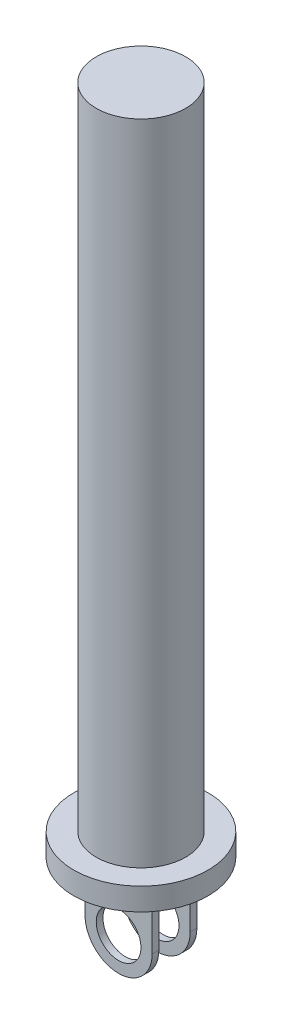
ISO-10303-21;
HEADER;
FILE_DESCRIPTION(('STEP AP214'),'2;1');
FILE_NAME('part.step','',(''),(''),'','','');
FILE_SCHEMA(('AUTOMOTIVE_DESIGN { 1 0 10303 214 1 1 1 1 }'));
ENDSEC;
DATA;
#1=APPLICATION_CONTEXT('core data for automotive mechanical design processes');
#2=APPLICATION_PROTOCOL_DEFINITION('international standard','automotive_design',2000,#1);
#3=PRODUCT_CONTEXT('',#1,'mechanical');
#4=PRODUCT('Part','Part','',(#3));
#5=PRODUCT_RELATED_PRODUCT_CATEGORY('part','',(#4));
#6=PRODUCT_DEFINITION_FORMATION('','',#4);
#7=PRODUCT_DEFINITION_CONTEXT('part definition',#1,'design');
#8=PRODUCT_DEFINITION('design','',#6,#7);
#9=PRODUCT_DEFINITION_SHAPE('','',#8);
#10=(LENGTH_UNIT() NAMED_UNIT(*) SI_UNIT(.MILLI.,.METRE.));
#11=(NAMED_UNIT(*) PLANE_ANGLE_UNIT() SI_UNIT($,.RADIAN.));
#12=(NAMED_UNIT(*) SI_UNIT($,.STERADIAN.) SOLID_ANGLE_UNIT());
#13=UNCERTAINTY_MEASURE_WITH_UNIT(LENGTH_MEASURE(1.E-05),#10,'distance_accuracy_value','');
#14=(GEOMETRIC_REPRESENTATION_CONTEXT(3) GLOBAL_UNCERTAINTY_ASSIGNED_CONTEXT((#13)) GLOBAL_UNIT_ASSIGNED_CONTEXT((#10,
#11,#12)) REPRESENTATION_CONTEXT('',''));
#15=CARTESIAN_POINT('',(0.,0.,0.));
#16=DIRECTION('',(0.,0.,1.));
#17=DIRECTION('',(1.,0.,0.));
#18=AXIS2_PLACEMENT_3D('',#15,#16,#17);
#19=CARTESIAN_POINT('',(-7.5,-20.,5.));
#20=DIRECTION('',(1.,0.,0.));
#21=DIRECTION('',(0.,0.,-1.));
#22=AXIS2_PLACEMENT_3D('',#19,#20,#21);
#23=PLANE('',#22);
#24=DIRECTION('',(0.,1.,0.));
#25=VECTOR('',#24,1.);
#26=CARTESIAN_POINT('',(-7.5,-20.000012,3.5));
#27=LINE('',#26,#25);
#28=CARTESIAN_POINT('',(-7.5,-12.5,3.5));
#29=VERTEX_POINT('',#28);
#30=CARTESIAN_POINT('',(-7.5,-5.,3.5));
#31=VERTEX_POINT('',#30);
#32=EDGE_CURVE('E158',#29,#31,#27,.T.);
#33=ORIENTED_EDGE('',*,*,#32,.F.);
#34=DIRECTION('',(0.,0.,-1.));
#35=VECTOR('',#34,1.);
#36=CARTESIAN_POINT('',(-7.5,-12.5,5.));
#37=LINE('',#36,#35);
#38=CARTESIAN_POINT('',(-7.5,-12.5,5.));
#39=VERTEX_POINT('',#38);
#40=EDGE_CURVE('E11',#29,#39,#37,.F.);
#41=ORIENTED_EDGE('',*,*,#40,.T.);
#42=DIRECTION('',(0.,1.,0.));
#43=VECTOR('',#42,1.);
#44=CARTESIAN_POINT('',(-7.5,-20.,5.));
#45=LINE('',#44,#43);
#46=CARTESIAN_POINT('',(-7.5,0.,5.));
#47=VERTEX_POINT('',#46);
#48=EDGE_CURVE('E187',#39,#47,#45,.T.);
#49=ORIENTED_EDGE('',*,*,#48,.T.);
#50=DIRECTION('',(0.,0.,-1.));
#51=VECTOR('',#50,1.);
#52=CARTESIAN_POINT('',(-7.5,0.,5.));
#53=LINE('',#52,#51);
#54=CARTESIAN_POINT('',(-7.5,0.,-5.));
#55=VERTEX_POINT('',#54);
#56=EDGE_CURVE('E170',#47,#55,#53,.T.);
#57=ORIENTED_EDGE('',*,*,#56,.T.);
#58=DIRECTION('',(0.,1.,0.));
#59=VECTOR('',#58,1.);
#60=CARTESIAN_POINT('',(-7.5,-20.,-5.));
#61=LINE('',#60,#59);
#62=CARTESIAN_POINT('',(-7.5,-12.5,-5.));
#63=VERTEX_POINT('',#62);
#64=EDGE_CURVE('E196',#63,#55,#61,.T.);
#65=ORIENTED_EDGE('',*,*,#64,.F.);
#66=DIRECTION('',(0.,0.,-1.));
#67=VECTOR('',#66,1.);
#68=CARTESIAN_POINT('',(-7.5,-12.5,5.));
#69=LINE('',#68,#67);
#70=CARTESIAN_POINT('',(-7.5,-12.5,-3.5));
#71=VERTEX_POINT('',#70);
#72=EDGE_CURVE('E55',#63,#71,#69,.F.);
#73=ORIENTED_EDGE('',*,*,#72,.T.);
#74=DIRECTION('',(0.,1.,0.));
#75=VECTOR('',#74,1.);
#76=CARTESIAN_POINT('',(-7.5,-20.000012,-3.5));
#77=LINE('',#76,#75);
#78=CARTESIAN_POINT('',(-7.5,-5.,-3.5));
#79=VERTEX_POINT('',#78);
#80=EDGE_CURVE('E122',#71,#79,#77,.T.);
#81=ORIENTED_EDGE('',*,*,#80,.T.);
#82=DIRECTION('',(0.,0.,-1.));
#83=VECTOR('',#82,1.);
#84=CARTESIAN_POINT('',(-7.5,-5.,3.5));
#85=LINE('',#84,#83);
#86=EDGE_CURVE('E126',#31,#79,#85,.T.);
#87=ORIENTED_EDGE('',*,*,#86,.F.);
#88=EDGE_LOOP('',(#33,#41,#49,#57,#65,#73,#81,#87));
#89=FACE_BOUND('',#88,.T.);
#90=ADVANCED_FACE('F45',(#89),#23,.F.);
#91=CARTESIAN_POINT('',(7.5,-20.,5.));
#92=DIRECTION('',(-1.,0.,0.));
#93=DIRECTION('',(0.,0.,1.));
#94=AXIS2_PLACEMENT_3D('',#91,#92,#93);
#95=PLANE('',#94);
#96=DIRECTION('',(0.,1.,0.));
#97=VECTOR('',#96,1.);
#98=CARTESIAN_POINT('',(7.5,-20.,5.));
#99=LINE('',#98,#97);
#100=CARTESIAN_POINT('',(7.5,-12.5,5.));
#101=VERTEX_POINT('',#100);
#102=CARTESIAN_POINT('',(7.5,0.,5.));
#103=VERTEX_POINT('',#102);
#104=EDGE_CURVE('E190',#101,#103,#99,.T.);
#105=ORIENTED_EDGE('',*,*,#104,.F.);
#106=DIRECTION('',(0.,0.,1.));
#107=VECTOR('',#106,1.);
#108=CARTESIAN_POINT('',(7.5,-12.5,5.));
#109=LINE('',#108,#107);
#110=CARTESIAN_POINT('',(7.5,-12.5,3.5));
#111=VERTEX_POINT('',#110);
#112=EDGE_CURVE('E235',#101,#111,#109,.F.);
#113=ORIENTED_EDGE('',*,*,#112,.T.);
#114=DIRECTION('',(0.,1.,0.));
#115=VECTOR('',#114,1.);
#116=CARTESIAN_POINT('',(7.5,-20.000012,3.5));
#117=LINE('',#116,#115);
#118=CARTESIAN_POINT('',(7.5,-5.,3.5));
#119=VERTEX_POINT('',#118);
#120=EDGE_CURVE('E161',#111,#119,#117,.T.);
#121=ORIENTED_EDGE('',*,*,#120,.T.);
#122=DIRECTION('',(0.,0.,1.));
#123=VECTOR('',#122,1.);
#124=CARTESIAN_POINT('',(7.5,-5.,3.5));
#125=LINE('',#124,#123);
#126=CARTESIAN_POINT('',(7.5,-5.,-3.5));
#127=VERTEX_POINT('',#126);
#128=EDGE_CURVE('E142',#127,#119,#125,.T.);
#129=ORIENTED_EDGE('',*,*,#128,.F.);
#130=DIRECTION('',(0.,1.,0.));
#131=VECTOR('',#130,1.);
#132=CARTESIAN_POINT('',(7.5,-20.000012,-3.5));
#133=LINE('',#132,#131);
#134=CARTESIAN_POINT('',(7.5,-12.5,-3.5));
#135=VERTEX_POINT('',#134);
#136=EDGE_CURVE('E132',#135,#127,#133,.T.);
#137=ORIENTED_EDGE('',*,*,#136,.F.);
#138=DIRECTION('',(0.,0.,1.));
#139=VECTOR('',#138,1.);
#140=CARTESIAN_POINT('',(7.5,-12.5,5.));
#141=LINE('',#140,#139);
#142=CARTESIAN_POINT('',(7.5,-12.5,-5.));
#143=VERTEX_POINT('',#142);
#144=EDGE_CURVE('E231',#135,#143,#141,.F.);
#145=ORIENTED_EDGE('',*,*,#144,.T.);
#146=DIRECTION('',(0.,1.,0.));
#147=VECTOR('',#146,1.);
#148=CARTESIAN_POINT('',(7.5,-20.,-5.));
#149=LINE('',#148,#147);
#150=CARTESIAN_POINT('',(7.5,0.,-5.));
#151=VERTEX_POINT('',#150);
#152=EDGE_CURVE('E193',#143,#151,#149,.T.);
#153=ORIENTED_EDGE('',*,*,#152,.T.);
#154=DIRECTION('',(0.,0.,1.));
#155=VECTOR('',#154,1.);
#156=CARTESIAN_POINT('',(7.5,0.,5.));
#157=LINE('',#156,#155);
#158=EDGE_CURVE('E179',#151,#103,#157,.T.);
#159=ORIENTED_EDGE('',*,*,#158,.T.);
#160=EDGE_LOOP('',(#105,#113,#121,#129,#137,#145,#153,#159));
#161=FACE_BOUND('',#160,.T.);
#162=ADVANCED_FACE('F263',(#161),#95,.F.);
#163=CARTESIAN_POINT('',(0.,-12.5,-15.));
#164=DIRECTION('',(0.,0.,1.));
#165=DIRECTION('',(1.,0.,0.));
#166=AXIS2_PLACEMENT_3D('',#163,#164,#165);
#167=CYLINDRICAL_SURFACE('',#166,5.);
#168=CARTESIAN_POINT('',(0.,-12.5,-5.));
#169=DIRECTION('',(0.,0.,1.));
#170=DIRECTION('',(1.,0.,0.));
#171=AXIS2_PLACEMENT_3D('',#168,#169,#170);
#172=CIRCLE('',#171,5.);
#173=CARTESIAN_POINT('',(5.,-12.5,-5.));
#174=VERTEX_POINT('',#173);
#175=EDGE_CURVE('E166',#174,#174,#172,.T.);
#176=ORIENTED_EDGE('',*,*,#175,.F.);
#177=EDGE_LOOP('',(#176));
#178=FACE_BOUND('',#177,.T.);
#179=CARTESIAN_POINT('',(0.,-12.5,-3.5));
#180=DIRECTION('',(0.,0.,1.));
#181=DIRECTION('',(1.,0.,0.));
#182=AXIS2_PLACEMENT_3D('',#179,#180,#181);
#183=CIRCLE('',#182,5.);
#184=CARTESIAN_POINT('',(5.,-12.5,-3.5));
#185=VERTEX_POINT('',#184);
#186=EDGE_CURVE('E219',#185,#185,#183,.F.);
#187=ORIENTED_EDGE('',*,*,#186,.F.);
#188=EDGE_LOOP('',(#187));
#189=FACE_BOUND('',#188,.T.);
#190=ADVANCED_FACE('F282',(#178,#189),#167,.F.);
#191=CARTESIAN_POINT('',(0.,-12.5,5.));
#192=DIRECTION('',(0.,0.,-1.));
#193=DIRECTION('',(-1.,0.,0.));
#194=AXIS2_PLACEMENT_3D('',#191,#192,#193);
#195=CIRCLE('',#194,5.);
#196=CARTESIAN_POINT('',(-5.,-12.5,5.));
#197=VERTEX_POINT('',#196);
#198=EDGE_CURVE('E171',#197,#197,#195,.T.);
#199=ORIENTED_EDGE('',*,*,#198,.F.);
#200=EDGE_LOOP('',(#199));
#201=FACE_BOUND('',#200,.T.);
#202=CARTESIAN_POINT('',(0.,-12.5,3.5));
#203=DIRECTION('',(0.,0.,-1.));
#204=DIRECTION('',(-1.,0.,0.));
#205=AXIS2_PLACEMENT_3D('',#202,#203,#204);
#206=CIRCLE('',#205,5.);
#207=CARTESIAN_POINT('',(-5.,-12.5,3.5));
#208=VERTEX_POINT('',#207);
#209=EDGE_CURVE('E131',#208,#208,#206,.F.);
#210=ORIENTED_EDGE('',*,*,#209,.F.);
#211=EDGE_LOOP('',(#210));
#212=FACE_BOUND('',#211,.T.);
#213=ADVANCED_FACE('F303',(#201,#212),#167,.F.);
#214=CARTESIAN_POINT('',(0.,0.,0.));
#215=DIRECTION('',(0.,1.,0.));
#216=DIRECTION('',(0.,0.,1.));
#217=AXIS2_PLACEMENT_3D('',#214,#215,#216);
#218=PLANE('',#217);
#219=CARTESIAN_POINT('',(0.,0.,0.));
#220=DIRECTION('',(0.,1.,0.));
#221=DIRECTION('',(0.,0.,1.));
#222=AXIS2_PLACEMENT_3D('',#219,#220,#221);
#223=CIRCLE('',#222,15.);
#224=CARTESIAN_POINT('',(0.,0.,15.));
#225=VERTEX_POINT('',#224);
#226=EDGE_CURVE('E203',#225,#225,#223,.T.);
#227=ORIENTED_EDGE('',*,*,#226,.F.);
#228=EDGE_LOOP('',(#227));
#229=FACE_BOUND('',#228,.T.);
#230=ORIENTED_EDGE('',*,*,#56,.F.);
#231=DIRECTION('',(-1.,0.,0.));
#232=VECTOR('',#231,1.);
#233=CARTESIAN_POINT('',(7.5,0.,5.));
#234=LINE('',#233,#232);
#235=EDGE_CURVE('E183',#103,#47,#234,.T.);
#236=ORIENTED_EDGE('',*,*,#235,.F.);
#237=ORIENTED_EDGE('',*,*,#158,.F.);
#238=DIRECTION('',(1.,0.,0.));
#239=VECTOR('',#238,1.);
#240=CARTESIAN_POINT('',(7.5,0.,-5.));
#241=LINE('',#240,#239);
#242=EDGE_CURVE('E175',#55,#151,#241,.T.);
#243=ORIENTED_EDGE('',*,*,#242,.F.);
#244=EDGE_LOOP('',(#230,#236,#237,#243));
#245=FACE_BOUND('',#244,.T.);
#246=ADVANCED_FACE('F300',(#229,#245),#218,.F.);
#247=CARTESIAN_POINT('',(0.,5.,0.));
#248=DIRECTION('',(0.,-1.,0.));
#249=DIRECTION('',(0.,0.,-1.));
#250=AXIS2_PLACEMENT_3D('',#247,#248,#249);
#251=CYLINDRICAL_SURFACE('',#250,15.);
#252=CARTESIAN_POINT('',(0.,5.,0.));
#253=DIRECTION('',(0.,1.,0.));
#254=DIRECTION('',(0.,0.,1.));
#255=AXIS2_PLACEMENT_3D('',#252,#253,#254);
#256=CIRCLE('',#255,15.);
#257=CARTESIAN_POINT('',(0.,5.,15.));
#258=VERTEX_POINT('',#257);
#259=EDGE_CURVE('E209',#258,#258,#256,.T.);
#260=ORIENTED_EDGE('',*,*,#259,.F.);
#261=EDGE_LOOP('',(#260));
#262=FACE_BOUND('',#261,.T.);
#263=ORIENTED_EDGE('',*,*,#226,.T.);
#264=EDGE_LOOP('',(#263));
#265=FACE_BOUND('',#264,.T.);
#266=ADVANCED_FACE('F298',(#262,#265),#251,.T.);
#267=CARTESIAN_POINT('',(0.,5.,0.));
#268=DIRECTION('',(0.,1.,0.));
#269=DIRECTION('',(0.,0.,1.));
#270=AXIS2_PLACEMENT_3D('',#267,#268,#269);
#271=PLANE('',#270);
#272=CARTESIAN_POINT('',(0.,5.,0.));
#273=DIRECTION('',(0.,1.,0.));
#274=DIRECTION('',(0.,0.,1.));
#275=AXIS2_PLACEMENT_3D('',#272,#273,#274);
#276=CIRCLE('',#275,10.);
#277=CARTESIAN_POINT('',(0.,5.,10.));
#278=VERTEX_POINT('',#277);
#279=EDGE_CURVE('E204',#278,#278,#276,.T.);
#280=ORIENTED_EDGE('',*,*,#279,.F.);
#281=EDGE_LOOP('',(#280));
#282=FACE_BOUND('',#281,.T.);
#283=ORIENTED_EDGE('',*,*,#259,.T.);
#284=EDGE_LOOP('',(#283));
#285=FACE_BOUND('',#284,.T.);
#286=ADVANCED_FACE('F294',(#282,#285),#271,.T.);
#287=CARTESIAN_POINT('',(0.,150.,0.));
#288=DIRECTION('',(0.,-1.,0.));
#289=DIRECTION('',(0.,0.,-1.));
#290=AXIS2_PLACEMENT_3D('',#287,#288,#289);
#291=CYLINDRICAL_SURFACE('',#290,10.);
#292=CARTESIAN_POINT('',(0.,150.,0.));
#293=DIRECTION('',(0.,1.,0.));
#294=DIRECTION('',(0.,0.,1.));
#295=AXIS2_PLACEMENT_3D('',#292,#293,#294);
#296=CIRCLE('',#295,10.);
#297=CARTESIAN_POINT('',(0.,150.,10.));
#298=VERTEX_POINT('',#297);
#299=EDGE_CURVE('E199',#298,#298,#296,.T.);
#300=ORIENTED_EDGE('',*,*,#299,.F.);
#301=EDGE_LOOP('',(#300));
#302=FACE_BOUND('',#301,.T.);
#303=ORIENTED_EDGE('',*,*,#279,.T.);
#304=EDGE_LOOP('',(#303));
#305=FACE_BOUND('',#304,.T.);
#306=ADVANCED_FACE('F290',(#302,#305),#291,.T.);
#307=CARTESIAN_POINT('',(0.,150.,0.));
#308=DIRECTION('',(0.,1.,0.));
#309=DIRECTION('',(0.,0.,1.));
#310=AXIS2_PLACEMENT_3D('',#307,#308,#309);
#311=PLANE('',#310);
#312=ORIENTED_EDGE('',*,*,#299,.T.);
#313=EDGE_LOOP('',(#312));
#314=FACE_BOUND('',#313,.T.);
#315=ADVANCED_FACE('F287',(#314),#311,.T.);
#316=CARTESIAN_POINT('',(7.5,-20.,-5.));
#317=DIRECTION('',(0.,0.,1.));
#318=DIRECTION('',(1.,0.,0.));
#319=AXIS2_PLACEMENT_3D('',#316,#317,#318);
#320=PLANE('',#319);
#321=ORIENTED_EDGE('',*,*,#175,.T.);
#322=EDGE_LOOP('',(#321));
#323=FACE_BOUND('',#322,.T.);
#324=ORIENTED_EDGE('',*,*,#152,.F.);
#325=CARTESIAN_POINT('',(0.,-12.5,-5.));
#326=DIRECTION('',(0.,0.,1.));
#327=DIRECTION('',(1.,0.,0.));
#328=AXIS2_PLACEMENT_3D('',#325,#326,#327);
#329=CIRCLE('',#328,7.5);
#330=CARTESIAN_POINT('',(0.,-20.,-5.));
#331=VERTEX_POINT('',#330);
#332=EDGE_CURVE('E68',#143,#331,#329,.F.);
#333=ORIENTED_EDGE('',*,*,#332,.T.);
#334=CARTESIAN_POINT('',(0.,-12.5,-5.));
#335=DIRECTION('',(0.,0.,1.));
#336=DIRECTION('',(1.,0.,0.));
#337=AXIS2_PLACEMENT_3D('',#334,#335,#336);
#338=CIRCLE('',#337,7.5);
#339=EDGE_CURVE('E63',#331,#63,#338,.F.);
#340=ORIENTED_EDGE('',*,*,#339,.T.);
#341=ORIENTED_EDGE('',*,*,#64,.T.);
#342=ORIENTED_EDGE('',*,*,#242,.T.);
#343=EDGE_LOOP('',(#324,#333,#340,#341,#342));
#344=FACE_BOUND('',#343,.T.);
#345=ADVANCED_FACE('F286',(#323,#344),#320,.F.);
#346=CARTESIAN_POINT('',(7.5,-20.,5.));
#347=DIRECTION('',(0.,0.,-1.));
#348=DIRECTION('',(-1.,0.,0.));
#349=AXIS2_PLACEMENT_3D('',#346,#347,#348);
#350=PLANE('',#349);
#351=ORIENTED_EDGE('',*,*,#198,.T.);
#352=EDGE_LOOP('',(#351));
#353=FACE_BOUND('',#352,.T.);
#354=CARTESIAN_POINT('',(0.,-12.5,5.));
#355=DIRECTION('',(0.,0.,-1.));
#356=DIRECTION('',(-1.,0.,0.));
#357=AXIS2_PLACEMENT_3D('',#354,#355,#356);
#358=CIRCLE('',#357,7.5);
#359=CARTESIAN_POINT('',(0.,-20.,5.));
#360=VERTEX_POINT('',#359);
#361=EDGE_CURVE('E208',#39,#360,#358,.F.);
#362=ORIENTED_EDGE('',*,*,#361,.T.);
#363=CARTESIAN_POINT('',(0.,-12.5,5.));
#364=DIRECTION('',(0.,0.,-1.));
#365=DIRECTION('',(-1.,0.,0.));
#366=AXIS2_PLACEMENT_3D('',#363,#364,#365);
#367=CIRCLE('',#366,7.5);
#368=EDGE_CURVE('E228',#360,#101,#367,.F.);
#369=ORIENTED_EDGE('',*,*,#368,.T.);
#370=ORIENTED_EDGE('',*,*,#104,.T.);
#371=ORIENTED_EDGE('',*,*,#235,.T.);
#372=ORIENTED_EDGE('',*,*,#48,.F.);
#373=EDGE_LOOP('',(#362,#369,#370,#371,#372));
#374=FACE_BOUND('',#373,.T.);
#375=ADVANCED_FACE('F322',(#353,#374),#350,.F.);
#376=CARTESIAN_POINT('',(-7.5,-20.000012,-3.5));
#377=DIRECTION('',(0.,0.,1.));
#378=DIRECTION('',(1.,0.,0.));
#379=AXIS2_PLACEMENT_3D('',#376,#377,#378);
#380=PLANE('',#379);
#381=ORIENTED_EDGE('',*,*,#186,.T.);
#382=EDGE_LOOP('',(#381));
#383=FACE_BOUND('',#382,.T.);
#384=CARTESIAN_POINT('',(0.,-12.5,-3.5));
#385=DIRECTION('',(0.,0.,1.));
#386=DIRECTION('',(1.,0.,0.));
#387=AXIS2_PLACEMENT_3D('',#384,#385,#386);
#388=CIRCLE('',#387,7.5);
#389=CARTESIAN_POINT('',(0.,-20.,-3.5));
#390=VERTEX_POINT('',#389);
#391=EDGE_CURVE('E245',#71,#390,#388,.T.);
#392=ORIENTED_EDGE('',*,*,#391,.T.);
#393=CARTESIAN_POINT('',(0.,-12.5,-3.5));
#394=DIRECTION('',(0.,0.,1.));
#395=DIRECTION('',(1.,0.,0.));
#396=AXIS2_PLACEMENT_3D('',#393,#394,#395);
#397=CIRCLE('',#396,7.5);
#398=EDGE_CURVE('E248',#390,#135,#397,.T.);
#399=ORIENTED_EDGE('',*,*,#398,.T.);
#400=ORIENTED_EDGE('',*,*,#136,.T.);
#401=DIRECTION('',(1.,0.,0.));
#402=VECTOR('',#401,1.);
#403=CARTESIAN_POINT('',(-7.5,-5.,-3.5));
#404=LINE('',#403,#402);
#405=EDGE_CURVE('E135',#79,#127,#404,.T.);
#406=ORIENTED_EDGE('',*,*,#405,.F.);
#407=ORIENTED_EDGE('',*,*,#80,.F.);
#408=EDGE_LOOP('',(#392,#399,#400,#406,#407));
#409=FACE_BOUND('',#408,.T.);
#410=ADVANCED_FACE('F136',(#383,#409),#380,.T.);
#411=CARTESIAN_POINT('',(-7.5,-20.000012,3.5));
#412=DIRECTION('',(0.,0.,-1.));
#413=DIRECTION('',(-1.,0.,0.));
#414=AXIS2_PLACEMENT_3D('',#411,#412,#413);
#415=PLANE('',#414);
#416=ORIENTED_EDGE('',*,*,#209,.T.);
#417=EDGE_LOOP('',(#416));
#418=FACE_BOUND('',#417,.T.);
#419=ORIENTED_EDGE('',*,*,#120,.F.);
#420=CARTESIAN_POINT('',(0.,-12.5,3.5));
#421=DIRECTION('',(0.,0.,-1.));
#422=DIRECTION('',(-1.,0.,0.));
#423=AXIS2_PLACEMENT_3D('',#420,#421,#422);
#424=CIRCLE('',#423,7.5);
#425=CARTESIAN_POINT('',(0.,-20.,3.5));
#426=VERTEX_POINT('',#425);
#427=EDGE_CURVE('E242',#111,#426,#424,.T.);
#428=ORIENTED_EDGE('',*,*,#427,.T.);
#429=CARTESIAN_POINT('',(0.,-12.5,3.5));
#430=DIRECTION('',(0.,0.,-1.));
#431=DIRECTION('',(-1.,0.,0.));
#432=AXIS2_PLACEMENT_3D('',#429,#430,#431);
#433=CIRCLE('',#432,7.5);
#434=EDGE_CURVE('E239',#426,#29,#433,.T.);
#435=ORIENTED_EDGE('',*,*,#434,.T.);
#436=ORIENTED_EDGE('',*,*,#32,.T.);
#437=DIRECTION('',(-1.,0.,0.));
#438=VECTOR('',#437,1.);
#439=CARTESIAN_POINT('',(-7.5,-5.,3.5));
#440=LINE('',#439,#438);
#441=EDGE_CURVE('E147',#119,#31,#440,.T.);
#442=ORIENTED_EDGE('',*,*,#441,.F.);
#443=EDGE_LOOP('',(#419,#428,#435,#436,#442));
#444=FACE_BOUND('',#443,.T.);
#445=ADVANCED_FACE('F313',(#418,#444),#415,.T.);
#446=CARTESIAN_POINT('',(0.,-5.,0.));
#447=DIRECTION('',(0.,-1.,0.));
#448=DIRECTION('',(0.,0.,-1.));
#449=AXIS2_PLACEMENT_3D('',#446,#447,#448);
#450=PLANE('',#449);
#451=ORIENTED_EDGE('',*,*,#86,.T.);
#452=ORIENTED_EDGE('',*,*,#405,.T.);
#453=ORIENTED_EDGE('',*,*,#128,.T.);
#454=ORIENTED_EDGE('',*,*,#441,.T.);
#455=EDGE_LOOP('',(#451,#452,#453,#454));
#456=FACE_BOUND('',#455,.T.);
#457=ADVANCED_FACE('F145',(#456),#450,.T.);
#458=CARTESIAN_POINT('',(0.,-12.5,0.));
#459=DIRECTION('',(0.,0.,-1.));
#460=DIRECTION('',(-1.,0.,0.));
#461=AXIS2_PLACEMENT_3D('',#458,#459,#460);
#462=CYLINDRICAL_SURFACE('',#461,7.5);
#463=ORIENTED_EDGE('',*,*,#40,.F.);
#464=ORIENTED_EDGE('',*,*,#434,.F.);
#465=DIRECTION('',(0.,0.,-1.));
#466=VECTOR('',#465,1.);
#467=CARTESIAN_POINT('',(0.,-20.,0.));
#468=LINE('',#467,#466);
#469=EDGE_CURVE('E149',#360,#426,#468,.T.);
#470=ORIENTED_EDGE('',*,*,#469,.F.);
#471=ORIENTED_EDGE('',*,*,#361,.F.);
#472=EDGE_LOOP('',(#463,#464,#470,#471));
#473=FACE_BOUND('',#472,.T.);
#474=ADVANCED_FACE('F273',(#473),#462,.T.);
#475=CARTESIAN_POINT('',(0.,-12.5,0.));
#476=DIRECTION('',(0.,0.,1.));
#477=DIRECTION('',(1.,0.,0.));
#478=AXIS2_PLACEMENT_3D('',#475,#476,#477);
#479=CYLINDRICAL_SURFACE('',#478,7.5);
#480=ORIENTED_EDGE('',*,*,#427,.F.);
#481=ORIENTED_EDGE('',*,*,#112,.F.);
#482=ORIENTED_EDGE('',*,*,#368,.F.);
#483=ORIENTED_EDGE('',*,*,#469,.T.);
#484=EDGE_LOOP('',(#480,#481,#482,#483));
#485=FACE_BOUND('',#484,.T.);
#486=ADVANCED_FACE('F268',(#485),#479,.T.);
#487=CARTESIAN_POINT('',(0.,-12.5,0.));
#488=DIRECTION('',(0.,0.,-1.));
#489=DIRECTION('',(-1.,0.,0.));
#490=AXIS2_PLACEMENT_3D('',#487,#488,#489);
#491=CYLINDRICAL_SURFACE('',#490,7.5);
#492=ORIENTED_EDGE('',*,*,#72,.F.);
#493=ORIENTED_EDGE('',*,*,#339,.F.);
#494=DIRECTION('',(0.,0.,-1.));
#495=VECTOR('',#494,1.);
#496=CARTESIAN_POINT('',(0.,-20.,0.));
#497=LINE('',#496,#495);
#498=EDGE_CURVE('E49',#390,#331,#497,.T.);
#499=ORIENTED_EDGE('',*,*,#498,.F.);
#500=ORIENTED_EDGE('',*,*,#391,.F.);
#501=EDGE_LOOP('',(#492,#493,#499,#500));
#502=FACE_BOUND('',#501,.T.);
#503=ADVANCED_FACE('F47',(#502),#491,.T.);
#504=CARTESIAN_POINT('',(0.,-12.5,0.));
#505=DIRECTION('',(0.,0.,1.));
#506=DIRECTION('',(1.,0.,0.));
#507=AXIS2_PLACEMENT_3D('',#504,#505,#506);
#508=CYLINDRICAL_SURFACE('',#507,7.5);
#509=ORIENTED_EDGE('',*,*,#332,.F.);
#510=ORIENTED_EDGE('',*,*,#144,.F.);
#511=ORIENTED_EDGE('',*,*,#398,.F.);
#512=ORIENTED_EDGE('',*,*,#498,.T.);
#513=EDGE_LOOP('',(#509,#510,#511,#512));
#514=FACE_BOUND('',#513,.T.);
#515=ADVANCED_FACE('F264',(#514),#508,.T.);
#516=CLOSED_SHELL('',(#90,#162,#190,#213,#246,#266,#286,#306,#315,#345,#375,#410,#445,#457,#474,
#486,#503,#515));
#517=MANIFOLD_SOLID_BREP('B2',#516);
#518=ADVANCED_BREP_SHAPE_REPRESENTATION('',(#18,#517),#14);
#519=SHAPE_DEFINITION_REPRESENTATION(#9,#518);
ENDSEC;
END-ISO-10303-21;
